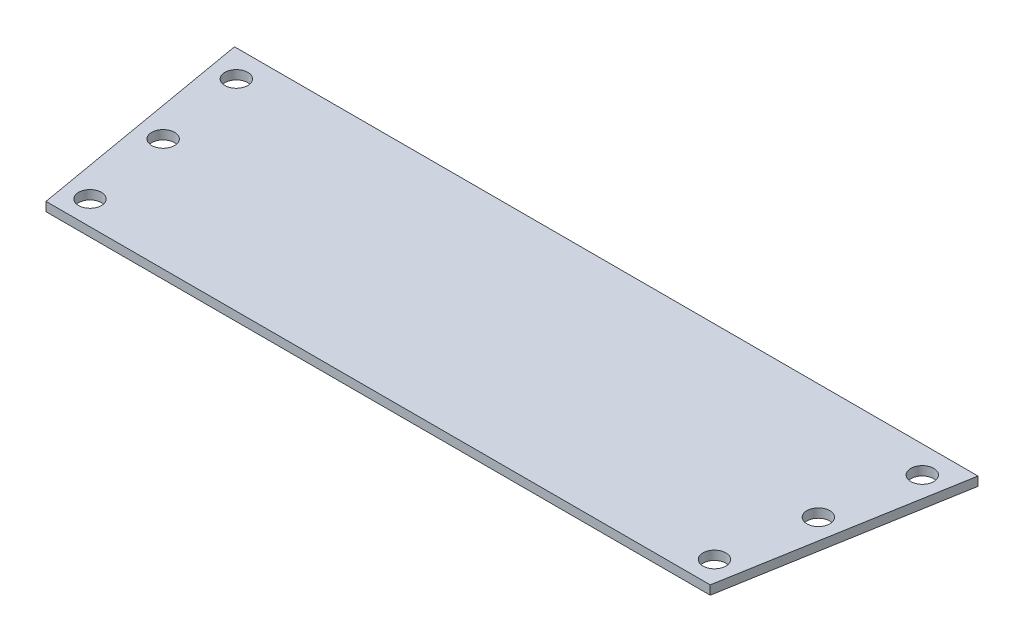
ISO-10303-21;
HEADER;
FILE_DESCRIPTION(('STEP AP214'),'2;1');
FILE_NAME('part.step','',(''),(''),'','','');
FILE_SCHEMA(('AUTOMOTIVE_DESIGN { 1 0 10303 214 1 1 1 1 }'));
ENDSEC;
DATA;
#1=APPLICATION_CONTEXT('core data for automotive mechanical design processes');
#2=APPLICATION_PROTOCOL_DEFINITION('international standard','automotive_design',2000,#1);
#3=PRODUCT_CONTEXT('',#1,'mechanical');
#4=PRODUCT('Part','Part','',(#3));
#5=PRODUCT_RELATED_PRODUCT_CATEGORY('part','',(#4));
#6=PRODUCT_DEFINITION_FORMATION('','',#4);
#7=PRODUCT_DEFINITION_CONTEXT('part definition',#1,'design');
#8=PRODUCT_DEFINITION('design','',#6,#7);
#9=PRODUCT_DEFINITION_SHAPE('','',#8);
#10=(LENGTH_UNIT() NAMED_UNIT(*) SI_UNIT(.MILLI.,.METRE.));
#11=(NAMED_UNIT(*) PLANE_ANGLE_UNIT() SI_UNIT($,.RADIAN.));
#12=(NAMED_UNIT(*) SI_UNIT($,.STERADIAN.) SOLID_ANGLE_UNIT());
#13=UNCERTAINTY_MEASURE_WITH_UNIT(LENGTH_MEASURE(1.E-05),#10,'distance_accuracy_value','');
#14=(GEOMETRIC_REPRESENTATION_CONTEXT(3) GLOBAL_UNCERTAINTY_ASSIGNED_CONTEXT((#13)) GLOBAL_UNIT_ASSIGNED_CONTEXT((#10,
#11,#12)) REPRESENTATION_CONTEXT('',''));
#15=CARTESIAN_POINT('',(0.,0.,0.));
#16=DIRECTION('',(0.,0.,1.));
#17=DIRECTION('',(1.,0.,0.));
#18=AXIS2_PLACEMENT_3D('',#15,#16,#17);
#19=CARTESIAN_POINT('',(0.,0.,0.));
#20=DIRECTION('',(0.,1.,0.));
#21=DIRECTION('',(0.,0.,1.));
#22=AXIS2_PLACEMENT_3D('',#19,#20,#21);
#23=PLANE('',#22);
#24=CARTESIAN_POINT('',(75.0785438249611,-7.7715611723761E-13,-4.29488451365112));
#25=DIRECTION('',(0.,0.999999999999995,0.));
#26=DIRECTION('',(0.,0.,0.999999999999931));
#27=AXIS2_PLACEMENT_3D('',#24,#25,#26);
#28=CIRCLE('',#27,2.54999999999999);
#29=CARTESIAN_POINT('',(75.0785438249611,-7.80066197354745E-13,-1.74488451365113));
#30=VERTEX_POINT('',#29);
#31=EDGE_CURVE('E320',#30,#30,#28,.T.);
#32=ORIENTED_EDGE('',*,*,#31,.T.);
#33=EDGE_LOOP('',(#32));
#34=FACE_BOUND('',#33,.T.);
#35=CARTESIAN_POINT('',(71.6567864300403,-9.57567358739198E-13,15.4102309726966));
#36=DIRECTION('',(0.,0.999999999999995,0.));
#37=DIRECTION('',(0.,0.,0.999999999999931));
#38=AXIS2_PLACEMENT_3D('',#35,#36,#37);
#39=CIRCLE('',#38,2.54999999999999);
#40=CARTESIAN_POINT('',(71.6567864300403,-9.60477438856333E-13,17.9602309726966));
#41=VERTEX_POINT('',#40);
#42=EDGE_CURVE('E309',#41,#41,#39,.T.);
#43=ORIENTED_EDGE('',*,*,#42,.T.);
#44=EDGE_LOOP('',(#43));
#45=FACE_BOUND('',#44,.T.);
#46=CARTESIAN_POINT('',(-74.1533728168104,-9.85322934354826E-13,-23.9999999999994));
#47=DIRECTION('',(0.,0.999999999999995,0.));
#48=DIRECTION('',(0.,0.,0.999999999999942));
#49=AXIS2_PLACEMENT_3D('',#46,#47,#48);
#50=CIRCLE('',#49,2.54999999999999);
#51=CARTESIAN_POINT('',(-74.1533728168104,-9.88233014471962E-13,-21.4499999999994));
#52=VERTEX_POINT('',#51);
#53=EDGE_CURVE('E290',#52,#52,#50,.T.);
#54=ORIENTED_EDGE('',*,*,#53,.T.);
#55=EDGE_LOOP('',(#54));
#56=FACE_BOUND('',#55,.T.);
#57=CARTESIAN_POINT('',(-70.7316154219015,-8.88178419700125E-13,-4.29488451365159));
#58=DIRECTION('',(0.,0.999999999999995,0.));
#59=DIRECTION('',(0.,0.,0.999999999999932));
#60=AXIS2_PLACEMENT_3D('',#57,#58,#59);
#61=CIRCLE('',#60,2.54999999999999);
#62=CARTESIAN_POINT('',(-70.7316154219015,-8.9108849981726E-13,-1.7448845136516));
#63=VERTEX_POINT('',#62);
#64=EDGE_CURVE('E296',#63,#63,#61,.T.);
#65=ORIENTED_EDGE('',*,*,#64,.T.);
#66=EDGE_LOOP('',(#65));
#67=FACE_BOUND('',#66,.T.);
#68=CARTESIAN_POINT('',(-67.3098580269691,-9.0205620750794E-13,15.4102309726962));
#69=DIRECTION('',(0.,0.999999999999995,0.));
#70=DIRECTION('',(0.,0.,0.999999999999931));
#71=AXIS2_PLACEMENT_3D('',#68,#69,#70);
#72=CIRCLE('',#71,2.54999999999999);
#73=CARTESIAN_POINT('',(-67.3098580269691,-9.04966287625075E-13,17.9602309726962));
#74=VERTEX_POINT('',#73);
#75=EDGE_CURVE('E297',#74,#74,#72,.T.);
#76=ORIENTED_EDGE('',*,*,#75,.T.);
#77=EDGE_LOOP('',(#76));
#78=FACE_BOUND('',#77,.T.);
#79=CARTESIAN_POINT('',(78.5003012198726,-4.9960036108132E-13,-23.9999999999989));
#80=DIRECTION('',(0.,0.999999999999995,0.));
#81=DIRECTION('',(0.,0.,0.999999999999931));
#82=AXIS2_PLACEMENT_3D('',#79,#80,#81);
#83=CIRCLE('',#82,2.54999999999999);
#84=CARTESIAN_POINT('',(78.5003012198726,-5.02510441198456E-13,-21.4499999999989));
#85=VERTEX_POINT('',#84);
#86=EDGE_CURVE('E308',#85,#85,#83,.T.);
#87=ORIENTED_EDGE('',*,*,#86,.T.);
#88=EDGE_LOOP('',(#87));
#89=FACE_BOUND('',#88,.T.);
#90=DIRECTION('',(-0.171087869746038,0.,0.985255774317392));
#91=VECTOR('',#90,1.);
#92=CARTESIAN_POINT('',(77.3579510360545,0.,13.4330672254587));
#93=LINE('',#92,#91);
#94=CARTESIAN_POINT('',(84.9000240102408,0.,-30.));
#95=VERTEX_POINT('',#94);
#96=CARTESIAN_POINT('',(76.0836749748174,0.,20.7713305942873));
#97=VERTEX_POINT('',#96);
#98=EDGE_CURVE('E269',#95,#97,#93,.T.);
#99=ORIENTED_EDGE('',*,*,#98,.T.);
#100=DIRECTION('',(1.,0.,0.));
#101=VECTOR('',#100,1.);
#102=CARTESIAN_POINT('',(0.,1.66533453693773E-13,20.771330594287));
#103=LINE('',#102,#101);
#104=CARTESIAN_POINT('',(-71.7367465717461,1.66533453693773E-13,20.7713305942868));
#105=VERTEX_POINT('',#104);
#106=EDGE_CURVE('E285',#105,#97,#103,.T.);
#107=ORIENTED_EDGE('',*,*,#106,.F.);
#108=DIRECTION('',(0.171087869746033,0.,0.985255774317392));
#109=VECTOR('',#108,1.);
#110=CARTESIAN_POINT('',(-73.1382618314956,0.,12.7003258847658));
#111=LINE('',#110,#109);
#112=CARTESIAN_POINT('',(-80.5530956071692,0.,-30.));
#113=VERTEX_POINT('',#112);
#114=EDGE_CURVE('E245',#113,#105,#111,.T.);
#115=ORIENTED_EDGE('',*,*,#114,.F.);
#116=DIRECTION('',(1.,0.,0.));
#117=VECTOR('',#116,1.);
#118=CARTESIAN_POINT('',(0.,0.,-30.));
#119=LINE('',#118,#117);
#120=EDGE_CURVE('E234',#113,#95,#119,.T.);
#121=ORIENTED_EDGE('',*,*,#120,.T.);
#122=EDGE_LOOP('',(#99,#107,#115,#121));
#123=FACE_BOUND('',#122,.T.);
#124=ADVANCED_FACE('F230',(#34,#45,#56,#67,#78,#89,#123),#23,.F.);
#125=CARTESIAN_POINT('',(0.,2.,-30.));
#126=DIRECTION('',(0.,0.,-1.));
#127=DIRECTION('',(-1.,0.,0.));
#128=AXIS2_PLACEMENT_3D('',#125,#126,#127);
#129=PLANE('',#128);
#130=DIRECTION('',(1.,0.,0.));
#131=VECTOR('',#130,1.);
#132=CARTESIAN_POINT('',(0.,2.,-30.));
#133=LINE('',#132,#131);
#134=CARTESIAN_POINT('',(-80.5530956071692,2.00000000000049,-30.));
#135=VERTEX_POINT('',#134);
#136=CARTESIAN_POINT('',(84.9000240102408,2.00000000000049,-30.));
#137=VERTEX_POINT('',#136);
#138=EDGE_CURVE('E12',#135,#137,#133,.T.);
#139=ORIENTED_EDGE('',*,*,#138,.T.);
#140=DIRECTION('',(0.,-1.,0.));
#141=VECTOR('',#140,1.);
#142=CARTESIAN_POINT('',(84.9000240102408,2.00000000000049,-30.));
#143=LINE('',#142,#141);
#144=EDGE_CURVE('E272',#137,#95,#143,.T.);
#145=ORIENTED_EDGE('',*,*,#144,.T.);
#146=ORIENTED_EDGE('',*,*,#120,.F.);
#147=DIRECTION('',(0.,-1.,0.));
#148=VECTOR('',#147,1.);
#149=CARTESIAN_POINT('',(-80.5530956071692,2.00000000000049,-30.));
#150=LINE('',#149,#148);
#151=EDGE_CURVE('E328',#135,#113,#150,.T.);
#152=ORIENTED_EDGE('',*,*,#151,.F.);
#153=EDGE_LOOP('',(#139,#145,#146,#152));
#154=FACE_BOUND('',#153,.T.);
#155=ADVANCED_FACE('F232',(#154),#129,.T.);
#156=CARTESIAN_POINT('',(0.,2.,0.));
#157=DIRECTION('',(0.,1.,0.));
#158=DIRECTION('',(0.,0.,1.));
#159=AXIS2_PLACEMENT_3D('',#156,#157,#158);
#160=PLANE('',#159);
#161=CARTESIAN_POINT('',(78.5003012198726,2.00000000000047,-23.9999999999989));
#162=DIRECTION('',(0.,0.999999999999995,0.));
#163=DIRECTION('',(0.,0.,0.999999999999931));
#164=AXIS2_PLACEMENT_3D('',#161,#162,#163);
#165=CIRCLE('',#164,2.54999999999999);
#166=CARTESIAN_POINT('',(78.5003012198726,2.00000000000047,-21.4499999999989));
#167=VERTEX_POINT('',#166);
#168=EDGE_CURVE('E305',#167,#167,#165,.T.);
#169=ORIENTED_EDGE('',*,*,#168,.F.);
#170=EDGE_LOOP('',(#169));
#171=FACE_BOUND('',#170,.T.);
#172=CARTESIAN_POINT('',(-67.3098580269691,2.00000000000007,15.4102309726962));
#173=DIRECTION('',(0.,0.999999999999995,0.));
#174=DIRECTION('',(0.,0.,0.999999999999931));
#175=AXIS2_PLACEMENT_3D('',#172,#173,#174);
#176=CIRCLE('',#175,2.54999999999999);
#177=CARTESIAN_POINT('',(-67.3098580269691,2.00000000000007,17.9602309726962));
#178=VERTEX_POINT('',#177);
#179=EDGE_CURVE('E312',#178,#178,#176,.T.);
#180=ORIENTED_EDGE('',*,*,#179,.F.);
#181=EDGE_LOOP('',(#180));
#182=FACE_BOUND('',#181,.T.);
#183=CARTESIAN_POINT('',(-70.7316154219015,2.00000000000009,-4.29488451365159));
#184=DIRECTION('',(0.,0.999999999999995,0.));
#185=DIRECTION('',(0.,0.,0.999999999999932));
#186=AXIS2_PLACEMENT_3D('',#183,#184,#185);
#187=CIRCLE('',#186,2.54999999999999);
#188=CARTESIAN_POINT('',(-70.7316154219015,2.00000000000008,-1.7448845136516));
#189=VERTEX_POINT('',#188);
#190=EDGE_CURVE('E293',#189,#189,#187,.T.);
#191=ORIENTED_EDGE('',*,*,#190,.F.);
#192=EDGE_LOOP('',(#191));
#193=FACE_BOUND('',#192,.T.);
#194=CARTESIAN_POINT('',(-74.1533728168104,1.99999999999999,-23.9999999999994));
#195=DIRECTION('',(0.,0.999999999999995,0.));
#196=DIRECTION('',(0.,0.,0.999999999999942));
#197=AXIS2_PLACEMENT_3D('',#194,#195,#196);
#198=CIRCLE('',#197,2.54999999999999);
#199=CARTESIAN_POINT('',(-74.1533728168104,1.99999999999999,-21.4499999999994));
#200=VERTEX_POINT('',#199);
#201=EDGE_CURVE('E300',#200,#200,#198,.T.);
#202=ORIENTED_EDGE('',*,*,#201,.F.);
#203=EDGE_LOOP('',(#202));
#204=FACE_BOUND('',#203,.T.);
#205=CARTESIAN_POINT('',(71.6567864300403,2.00000000000002,15.4102309726966));
#206=DIRECTION('',(0.,0.999999999999995,0.));
#207=DIRECTION('',(0.,0.,0.999999999999931));
#208=AXIS2_PLACEMENT_3D('',#205,#206,#207);
#209=CIRCLE('',#208,2.54999999999999);
#210=CARTESIAN_POINT('',(71.6567864300403,2.00000000000001,17.9602309726966));
#211=VERTEX_POINT('',#210);
#212=EDGE_CURVE('E323',#211,#211,#209,.T.);
#213=ORIENTED_EDGE('',*,*,#212,.F.);
#214=EDGE_LOOP('',(#213));
#215=FACE_BOUND('',#214,.T.);
#216=CARTESIAN_POINT('',(75.0785438249611,2.0000000000002,-4.29488451365112));
#217=DIRECTION('',(0.,0.999999999999995,0.));
#218=DIRECTION('',(0.,0.,0.999999999999931));
#219=AXIS2_PLACEMENT_3D('',#216,#217,#218);
#220=CIRCLE('',#219,2.54999999999999);
#221=CARTESIAN_POINT('',(75.0785438249611,2.00000000000019,-1.74488451365113));
#222=VERTEX_POINT('',#221);
#223=EDGE_CURVE('E317',#222,#222,#220,.T.);
#224=ORIENTED_EDGE('',*,*,#223,.F.);
#225=EDGE_LOOP('',(#224));
#226=FACE_BOUND('',#225,.T.);
#227=DIRECTION('',(1.,0.,0.));
#228=VECTOR('',#227,1.);
#229=CARTESIAN_POINT('',(0.,2.00000000000114,20.771330594287));
#230=LINE('',#229,#228);
#231=CARTESIAN_POINT('',(-71.7367465717461,2.00000000000049,20.7713305942868));
#232=VERTEX_POINT('',#231);
#233=CARTESIAN_POINT('',(76.0836749748174,2.00000000000114,20.7713305942873));
#234=VERTEX_POINT('',#233);
#235=EDGE_CURVE('E286',#232,#234,#230,.T.);
#236=ORIENTED_EDGE('',*,*,#235,.T.);
#237=DIRECTION('',(-0.171087869746038,0.,0.985255774317392));
#238=VECTOR('',#237,1.);
#239=CARTESIAN_POINT('',(77.3579510360545,2.00000000000049,13.4330672254587));
#240=LINE('',#239,#238);
#241=EDGE_CURVE('E253',#137,#234,#240,.T.);
#242=ORIENTED_EDGE('',*,*,#241,.F.);
#243=ORIENTED_EDGE('',*,*,#138,.F.);
#244=DIRECTION('',(0.171087869746033,0.,0.985255774317392));
#245=VECTOR('',#244,1.);
#246=CARTESIAN_POINT('',(-73.1382618314956,2.00000000000049,12.7003258847658));
#247=LINE('',#246,#245);
#248=EDGE_CURVE('E330',#135,#232,#247,.T.);
#249=ORIENTED_EDGE('',*,*,#248,.T.);
#250=EDGE_LOOP('',(#236,#242,#243,#249));
#251=FACE_BOUND('',#250,.T.);
#252=ADVANCED_FACE('F338',(#171,#182,#193,#204,#215,#226,#251),#160,.T.);
#253=CARTESIAN_POINT('',(0.,1.66533453693773E-13,20.771330594287));
#254=DIRECTION('',(0.,0.,1.));
#255=DIRECTION('',(1.,0.,0.));
#256=AXIS2_PLACEMENT_3D('',#253,#254,#255);
#257=PLANE('',#256);
#258=ORIENTED_EDGE('',*,*,#106,.T.);
#259=DIRECTION('',(0.,-1.,0.));
#260=VECTOR('',#259,1.);
#261=CARTESIAN_POINT('',(76.0836749748174,2.00000000000049,20.7713305942873));
#262=LINE('',#261,#260);
#263=EDGE_CURVE('E273',#234,#97,#262,.T.);
#264=ORIENTED_EDGE('',*,*,#263,.F.);
#265=ORIENTED_EDGE('',*,*,#235,.F.);
#266=DIRECTION('',(0.,-1.,0.));
#267=VECTOR('',#266,1.);
#268=CARTESIAN_POINT('',(-71.7367465717461,2.00000000000049,20.7713305942868));
#269=LINE('',#268,#267);
#270=EDGE_CURVE('E278',#232,#105,#269,.T.);
#271=ORIENTED_EDGE('',*,*,#270,.T.);
#272=EDGE_LOOP('',(#258,#264,#265,#271));
#273=FACE_BOUND('',#272,.T.);
#274=ADVANCED_FACE('F339',(#273),#257,.T.);
#275=CARTESIAN_POINT('',(75.0785438249611,-7.7715611723761E-13,-4.29488451365112));
#276=DIRECTION('',(0.,1.,0.));
#277=DIRECTION('',(0.,0.,1.));
#278=AXIS2_PLACEMENT_3D('',#275,#276,#277);
#279=CYLINDRICAL_SURFACE('',#278,2.54999999999999);
#280=CARTESIAN_POINT('',(75.0785438249611,-7.80066197354745E-13,-1.74488451365113));
#281=CARTESIAN_POINT('',(75.0785438249611,0.0208333333325634,-1.74488451365113));
#282=CARTESIAN_POINT('',(75.0785438249611,0.0416666666659069,-1.74488451365113));
#283=CARTESIAN_POINT('',(75.0785438249611,0.0833333333325939,-1.74488451365113));
#284=CARTESIAN_POINT('',(75.0785438249611,0.104166666665937,-1.74488451365113));
#285=CARTESIAN_POINT('',(75.0785438249611,0.145833333332624,-1.74488451365113));
#286=CARTESIAN_POINT('',(75.0785438249611,0.166666666665968,-1.74488451365113));
#287=CARTESIAN_POINT('',(75.0785438249611,0.208333333332655,-1.74488451365113));
#288=CARTESIAN_POINT('',(75.0785438249611,0.229166666665998,-1.74488451365113));
#289=CARTESIAN_POINT('',(75.0785438249611,0.270833333332685,-1.74488451365113));
#290=CARTESIAN_POINT('',(75.0785438249611,0.291666666666029,-1.74488451365113));
#291=CARTESIAN_POINT('',(75.0785438249611,0.333333333332716,-1.74488451365113));
#292=CARTESIAN_POINT('',(75.0785438249611,0.354166666666059,-1.74488451365113));
#293=CARTESIAN_POINT('',(75.0785438249611,0.395833333332746,-1.74488451365113));
#294=CARTESIAN_POINT('',(75.0785438249611,0.416666666666089,-1.74488451365113));
#295=CARTESIAN_POINT('',(75.0785438249611,0.458333333332776,-1.74488451365113));
#296=CARTESIAN_POINT('',(75.0785438249611,0.47916666666612,-1.74488451365113));
#297=CARTESIAN_POINT('',(75.0785438249611,0.520833333332807,-1.74488451365113));
#298=CARTESIAN_POINT('',(75.0785438249611,0.54166666666615,-1.74488451365113));
#299=CARTESIAN_POINT('',(75.0785438249611,0.583333333332837,-1.74488451365113));
#300=CARTESIAN_POINT('',(75.0785438249611,0.604166666666181,-1.74488451365113));
#301=CARTESIAN_POINT('',(75.0785438249611,0.645833333332868,-1.74488451365113));
#302=CARTESIAN_POINT('',(75.0785438249611,0.666666666666211,-1.74488451365113));
#303=CARTESIAN_POINT('',(75.0785438249611,0.708333333332898,-1.74488451365113));
#304=CARTESIAN_POINT('',(75.0785438249611,0.729166666666242,-1.74488451365113));
#305=CARTESIAN_POINT('',(75.0785438249611,0.770833333332929,-1.74488451365113));
#306=CARTESIAN_POINT('',(75.0785438249611,0.791666666666272,-1.74488451365113));
#307=CARTESIAN_POINT('',(75.0785438249611,0.833333333332959,-1.74488451365113));
#308=CARTESIAN_POINT('',(75.0785438249611,0.854166666666302,-1.74488451365113));
#309=CARTESIAN_POINT('',(75.0785438249611,0.895833333332989,-1.74488451365113));
#310=CARTESIAN_POINT('',(75.0785438249611,0.916666666666333,-1.74488451365113));
#311=CARTESIAN_POINT('',(75.0785438249611,0.95833333333302,-1.74488451365113));
#312=CARTESIAN_POINT('',(75.0785438249611,0.979166666666363,-1.74488451365113));
#313=CARTESIAN_POINT('',(75.0785438249611,1.02083333333305,-1.74488451365113));
#314=CARTESIAN_POINT('',(75.0785438249611,1.04166666666639,-1.74488451365113));
#315=CARTESIAN_POINT('',(75.0785438249611,1.08333333333308,-1.74488451365113));
#316=CARTESIAN_POINT('',(75.0785438249611,1.10416666666642,-1.74488451365113));
#317=CARTESIAN_POINT('',(75.0785438249611,1.14583333333311,-1.74488451365113));
#318=CARTESIAN_POINT('',(75.0785438249611,1.16666666666645,-1.74488451365113));
#319=CARTESIAN_POINT('',(75.0785438249611,1.20833333333314,-1.74488451365113));
#320=CARTESIAN_POINT('',(75.0785438249611,1.22916666666649,-1.74488451365113));
#321=CARTESIAN_POINT('',(75.0785438249611,1.27083333333317,-1.74488451365113));
#322=CARTESIAN_POINT('',(75.0785438249611,1.29166666666652,-1.74488451365113));
#323=CARTESIAN_POINT('',(75.0785438249611,1.3333333333332,-1.74488451365113));
#324=CARTESIAN_POINT('',(75.0785438249611,1.35416666666655,-1.74488451365113));
#325=CARTESIAN_POINT('',(75.0785438249611,1.39583333333323,-1.74488451365113));
#326=CARTESIAN_POINT('',(75.0785438249611,1.41666666666658,-1.74488451365113));
#327=CARTESIAN_POINT('',(75.0785438249611,1.45833333333326,-1.74488451365113));
#328=CARTESIAN_POINT('',(75.0785438249611,1.47916666666661,-1.74488451365113));
#329=CARTESIAN_POINT('',(75.0785438249611,1.52083333333329,-1.74488451365113));
#330=CARTESIAN_POINT('',(75.0785438249611,1.54166666666664,-1.74488451365113));
#331=CARTESIAN_POINT('',(75.0785438249611,1.58333333333332,-1.74488451365113));
#332=CARTESIAN_POINT('',(75.0785438249611,1.60416666666667,-1.74488451365113));
#333=CARTESIAN_POINT('',(75.0785438249611,1.64583333333335,-1.74488451365113));
#334=CARTESIAN_POINT('',(75.0785438249611,1.6666666666667,-1.74488451365113));
#335=CARTESIAN_POINT('',(75.0785438249611,1.70833333333338,-1.74488451365113));
#336=CARTESIAN_POINT('',(75.0785438249611,1.72916666666673,-1.74488451365113));
#337=CARTESIAN_POINT('',(75.0785438249611,1.77083333333342,-1.74488451365113));
#338=CARTESIAN_POINT('',(75.0785438249611,1.79166666666676,-1.74488451365113));
#339=CARTESIAN_POINT('',(75.0785438249611,1.83333333333345,-1.74488451365113));
#340=CARTESIAN_POINT('',(75.0785438249611,1.85416666666679,-1.74488451365113));
#341=CARTESIAN_POINT('',(75.0785438249611,1.89583333333348,-1.74488451365113));
#342=CARTESIAN_POINT('',(75.0785438249611,1.91666666666682,-1.74488451365113));
#343=CARTESIAN_POINT('',(75.0785438249611,1.95833333333351,-1.74488451365113));
#344=CARTESIAN_POINT('',(75.0785438249611,1.97916666666685,-1.74488451365113));
#345=CARTESIAN_POINT('',(75.0785438249611,2.00000000000019,-1.74488451365113));
#346=B_SPLINE_CURVE_WITH_KNOTS('',3,(#280,#281,#282,#283,#284,#285,#286,#287,#288,#289,#290,
#291,#292,#293,#294,#295,#296,#297,#298,#299,#300,#301,#302,#303,#304,#305,#306,#307,#308,#309,
#310,#311,#312,#313,#314,#315,#316,#317,#318,#319,#320,#321,#322,#323,#324,#325,#326,#327,#328,
#329,#330,#331,#332,#333,#334,#335,#336,#337,#338,#339,#340,#341,#342,#343,#344,#345),
.UNSPECIFIED.,.F.,.F.,(4,2,2,2,2,2,2,2,2,2,2,2,2,2,2,2,2,2,2,2,2,2,2,2,2,2,2,2,2,2,2,2,4),(0.,
0.0625000000000304,0.125000000000061,0.187500000000091,0.250000000000122,0.312500000000152,
0.375000000000183,0.437500000000213,0.500000000000243,0.562500000000274,0.625000000000304,
0.687500000000335,0.750000000000365,0.812500000000396,0.875000000000426,0.937500000000456,
1.00000000000049,1.06250000000052,1.12500000000055,1.18750000000058,1.25000000000061,
1.31250000000064,1.37500000000067,1.4375000000007,1.50000000000073,1.56250000000076,
1.62500000000079,1.68750000000082,1.75000000000085,1.81250000000088,1.87500000000091,
1.93750000000094,2.00000000000097),.UNSPECIFIED.);
#347=EDGE_CURVE('BSEAM366',#30,#222,#346,.T.);
#348=ORIENTED_EDGE('',*,*,#31,.F.);
#349=ORIENTED_EDGE('',*,*,#223,.T.);
#350=ORIENTED_EDGE('',*,*,#347,.T.);
#351=ORIENTED_EDGE('',*,*,#347,.F.);
#352=EDGE_LOOP('',(#348,#350,#349,#351));
#353=FACE_BOUND('',#352,.T.);
#354=ADVANCED_FACE('F366',(#353),#279,.F.);
#355=CARTESIAN_POINT('',(71.6567864300403,-9.57567358739198E-13,15.4102309726966));
#356=DIRECTION('',(0.,1.,0.));
#357=DIRECTION('',(0.,0.,1.));
#358=AXIS2_PLACEMENT_3D('',#355,#356,#357);
#359=CYLINDRICAL_SURFACE('',#358,2.54999999999999);
#360=CARTESIAN_POINT('',(71.6567864300403,-9.60477438856333E-13,17.9602309726966));
#361=CARTESIAN_POINT('',(71.6567864300403,0.020833333332383,17.9602309726966));
#362=CARTESIAN_POINT('',(71.6567864300403,0.0416666666657265,17.9602309726966));
#363=CARTESIAN_POINT('',(71.6567864300403,0.0833333333324134,17.9602309726966));
#364=CARTESIAN_POINT('',(71.6567864300403,0.104166666665757,17.9602309726966));
#365=CARTESIAN_POINT('',(71.6567864300403,0.145833333332444,17.9602309726966));
#366=CARTESIAN_POINT('',(71.6567864300403,0.166666666665787,17.9602309726966));
#367=CARTESIAN_POINT('',(71.6567864300403,0.208333333332474,17.9602309726966));
#368=CARTESIAN_POINT('',(71.6567864300403,0.229166666665818,17.9602309726966));
#369=CARTESIAN_POINT('',(71.6567864300403,0.270833333332505,17.9602309726966));
#370=CARTESIAN_POINT('',(71.6567864300403,0.291666666665848,17.9602309726966));
#371=CARTESIAN_POINT('',(71.6567864300403,0.333333333332535,17.9602309726966));
#372=CARTESIAN_POINT('',(71.6567864300403,0.354166666665879,17.9602309726966));
#373=CARTESIAN_POINT('',(71.6567864300403,0.395833333332566,17.9602309726966));
#374=CARTESIAN_POINT('',(71.6567864300403,0.416666666665909,17.9602309726966));
#375=CARTESIAN_POINT('',(71.6567864300403,0.458333333332596,17.9602309726966));
#376=CARTESIAN_POINT('',(71.6567864300403,0.479166666665939,17.9602309726966));
#377=CARTESIAN_POINT('',(71.6567864300403,0.520833333332626,17.9602309726966));
#378=CARTESIAN_POINT('',(71.6567864300403,0.54166666666597,17.9602309726966));
#379=CARTESIAN_POINT('',(71.6567864300403,0.583333333332657,17.9602309726966));
#380=CARTESIAN_POINT('',(71.6567864300403,0.604166666666,17.9602309726966));
#381=CARTESIAN_POINT('',(71.6567864300403,0.645833333332687,17.9602309726966));
#382=CARTESIAN_POINT('',(71.6567864300403,0.666666666666031,17.9602309726966));
#383=CARTESIAN_POINT('',(71.6567864300403,0.708333333332718,17.9602309726966));
#384=CARTESIAN_POINT('',(71.6567864300403,0.729166666666061,17.9602309726966));
#385=CARTESIAN_POINT('',(71.6567864300403,0.770833333332748,17.9602309726966));
#386=CARTESIAN_POINT('',(71.6567864300403,0.791666666666092,17.9602309726966));
#387=CARTESIAN_POINT('',(71.6567864300403,0.833333333332779,17.9602309726966));
#388=CARTESIAN_POINT('',(71.6567864300403,0.854166666666122,17.9602309726966));
#389=CARTESIAN_POINT('',(71.6567864300403,0.895833333332809,17.9602309726966));
#390=CARTESIAN_POINT('',(71.6567864300403,0.916666666666152,17.9602309726966));
#391=CARTESIAN_POINT('',(71.6567864300403,0.958333333332839,17.9602309726966));
#392=CARTESIAN_POINT('',(71.6567864300403,0.979166666666183,17.9602309726966));
#393=CARTESIAN_POINT('',(71.6567864300403,1.02083333333287,17.9602309726966));
#394=CARTESIAN_POINT('',(71.6567864300403,1.04166666666621,17.9602309726966));
#395=CARTESIAN_POINT('',(71.6567864300403,1.0833333333329,17.9602309726966));
#396=CARTESIAN_POINT('',(71.6567864300403,1.10416666666624,17.9602309726966));
#397=CARTESIAN_POINT('',(71.6567864300403,1.14583333333293,17.9602309726966));
#398=CARTESIAN_POINT('',(71.6567864300403,1.16666666666627,17.9602309726966));
#399=CARTESIAN_POINT('',(71.6567864300403,1.20833333333296,17.9602309726966));
#400=CARTESIAN_POINT('',(71.6567864300403,1.2291666666663,17.9602309726966));
#401=CARTESIAN_POINT('',(71.6567864300403,1.27083333333299,17.9602309726966));
#402=CARTESIAN_POINT('',(71.6567864300403,1.29166666666634,17.9602309726966));
#403=CARTESIAN_POINT('',(71.6567864300403,1.33333333333302,17.9602309726966));
#404=CARTESIAN_POINT('',(71.6567864300403,1.35416666666637,17.9602309726966));
#405=CARTESIAN_POINT('',(71.6567864300403,1.39583333333305,17.9602309726966));
#406=CARTESIAN_POINT('',(71.6567864300403,1.4166666666664,17.9602309726966));
#407=CARTESIAN_POINT('',(71.6567864300403,1.45833333333308,17.9602309726966));
#408=CARTESIAN_POINT('',(71.6567864300403,1.47916666666643,17.9602309726966));
#409=CARTESIAN_POINT('',(71.6567864300403,1.52083333333311,17.9602309726966));
#410=CARTESIAN_POINT('',(71.6567864300403,1.54166666666646,17.9602309726966));
#411=CARTESIAN_POINT('',(71.6567864300403,1.58333333333314,17.9602309726966));
#412=CARTESIAN_POINT('',(71.6567864300403,1.60416666666649,17.9602309726966));
#413=CARTESIAN_POINT('',(71.6567864300403,1.64583333333317,17.9602309726966));
#414=CARTESIAN_POINT('',(71.6567864300403,1.66666666666652,17.9602309726966));
#415=CARTESIAN_POINT('',(71.6567864300403,1.7083333333332,17.9602309726966));
#416=CARTESIAN_POINT('',(71.6567864300403,1.72916666666655,17.9602309726966));
#417=CARTESIAN_POINT('',(71.6567864300403,1.77083333333324,17.9602309726966));
#418=CARTESIAN_POINT('',(71.6567864300403,1.79166666666658,17.9602309726966));
#419=CARTESIAN_POINT('',(71.6567864300403,1.83333333333327,17.9602309726966));
#420=CARTESIAN_POINT('',(71.6567864300403,1.85416666666661,17.9602309726966));
#421=CARTESIAN_POINT('',(71.6567864300403,1.8958333333333,17.9602309726966));
#422=CARTESIAN_POINT('',(71.6567864300403,1.91666666666664,17.9602309726966));
#423=CARTESIAN_POINT('',(71.6567864300403,1.95833333333333,17.9602309726966));
#424=CARTESIAN_POINT('',(71.6567864300403,1.97916666666667,17.9602309726966));
#425=CARTESIAN_POINT('',(71.6567864300403,2.00000000000001,17.9602309726966));
#426=B_SPLINE_CURVE_WITH_KNOTS('',3,(#360,#361,#362,#363,#364,#365,#366,#367,#368,#369,#370,
#371,#372,#373,#374,#375,#376,#377,#378,#379,#380,#381,#382,#383,#384,#385,#386,#387,#388,#389,
#390,#391,#392,#393,#394,#395,#396,#397,#398,#399,#400,#401,#402,#403,#404,#405,#406,#407,#408,
#409,#410,#411,#412,#413,#414,#415,#416,#417,#418,#419,#420,#421,#422,#423,#424,#425),
.UNSPECIFIED.,.F.,.F.,(4,2,2,2,2,2,2,2,2,2,2,2,2,2,2,2,2,2,2,2,2,2,2,2,2,2,2,2,2,2,2,2,4),(0.,
0.0625000000000304,0.125000000000061,0.187500000000091,0.250000000000122,0.312500000000152,
0.375000000000183,0.437500000000213,0.500000000000243,0.562500000000274,0.625000000000304,
0.687500000000335,0.750000000000365,0.812500000000396,0.875000000000426,0.937500000000456,
1.00000000000049,1.06250000000052,1.12500000000055,1.18750000000058,1.25000000000061,
1.31250000000064,1.37500000000067,1.4375000000007,1.50000000000073,1.56250000000076,
1.62500000000079,1.68750000000082,1.75000000000085,1.81250000000088,1.87500000000091,
1.93750000000094,2.00000000000097),.UNSPECIFIED.);
#427=EDGE_CURVE('BSEAM373',#41,#211,#426,.T.);
#428=ORIENTED_EDGE('',*,*,#42,.F.);
#429=ORIENTED_EDGE('',*,*,#212,.T.);
#430=ORIENTED_EDGE('',*,*,#427,.T.);
#431=ORIENTED_EDGE('',*,*,#427,.F.);
#432=EDGE_LOOP('',(#428,#430,#429,#431));
#433=FACE_BOUND('',#432,.T.);
#434=ADVANCED_FACE('F373',(#433),#359,.F.);
#435=CARTESIAN_POINT('',(-74.1533728168104,-9.85322934354826E-13,-23.9999999999994));
#436=DIRECTION('',(0.,1.,0.));
#437=DIRECTION('',(0.,0.,1.));
#438=AXIS2_PLACEMENT_3D('',#435,#436,#437);
#439=CYLINDRICAL_SURFACE('',#438,2.54999999999999);
#440=CARTESIAN_POINT('',(-74.1533728168104,-9.88233014471962E-13,-21.4499999999994));
#441=CARTESIAN_POINT('',(-74.1533728168104,0.0208333333323552,-21.4499999999994));
#442=CARTESIAN_POINT('',(-74.1533728168104,0.0416666666656987,-21.4499999999994));
#443=CARTESIAN_POINT('',(-74.1533728168104,0.0833333333323857,-21.4499999999994));
#444=CARTESIAN_POINT('',(-74.1533728168104,0.104166666665729,-21.4499999999994));
#445=CARTESIAN_POINT('',(-74.1533728168104,0.145833333332416,-21.4499999999994));
#446=CARTESIAN_POINT('',(-74.1533728168104,0.16666666666576,-21.4499999999994));
#447=CARTESIAN_POINT('',(-74.1533728168104,0.208333333332447,-21.4499999999994));
#448=CARTESIAN_POINT('',(-74.1533728168104,0.22916666666579,-21.4499999999994));
#449=CARTESIAN_POINT('',(-74.1533728168104,0.270833333332477,-21.4499999999994));
#450=CARTESIAN_POINT('',(-74.1533728168104,0.29166666666582,-21.4499999999994));
#451=CARTESIAN_POINT('',(-74.1533728168104,0.333333333332507,-21.4499999999994));
#452=CARTESIAN_POINT('',(-74.1533728168104,0.354166666665851,-21.4499999999994));
#453=CARTESIAN_POINT('',(-74.1533728168104,0.395833333332538,-21.4499999999994));
#454=CARTESIAN_POINT('',(-74.1533728168104,0.416666666665881,-21.4499999999994));
#455=CARTESIAN_POINT('',(-74.1533728168104,0.458333333332568,-21.4499999999994));
#456=CARTESIAN_POINT('',(-74.1533728168104,0.479166666665912,-21.4499999999994));
#457=CARTESIAN_POINT('',(-74.1533728168104,0.520833333332599,-21.4499999999994));
#458=CARTESIAN_POINT('',(-74.1533728168104,0.541666666665942,-21.4499999999994));
#459=CARTESIAN_POINT('',(-74.1533728168104,0.583333333332629,-21.4499999999994));
#460=CARTESIAN_POINT('',(-74.1533728168104,0.604166666665973,-21.4499999999994));
#461=CARTESIAN_POINT('',(-74.1533728168104,0.645833333332659,-21.4499999999994));
#462=CARTESIAN_POINT('',(-74.1533728168104,0.666666666666003,-21.4499999999994));
#463=CARTESIAN_POINT('',(-74.1533728168104,0.70833333333269,-21.4499999999994));
#464=CARTESIAN_POINT('',(-74.1533728168104,0.729166666666033,-21.4499999999994));
#465=CARTESIAN_POINT('',(-74.1533728168104,0.77083333333272,-21.4499999999994));
#466=CARTESIAN_POINT('',(-74.1533728168104,0.791666666666064,-21.4499999999994));
#467=CARTESIAN_POINT('',(-74.1533728168104,0.833333333332751,-21.4499999999994));
#468=CARTESIAN_POINT('',(-74.1533728168104,0.854166666666094,-21.4499999999994));
#469=CARTESIAN_POINT('',(-74.1533728168104,0.895833333332781,-21.4499999999994));
#470=CARTESIAN_POINT('',(-74.1533728168104,0.916666666666125,-21.4499999999994));
#471=CARTESIAN_POINT('',(-74.1533728168104,0.958333333332812,-21.4499999999994));
#472=CARTESIAN_POINT('',(-74.1533728168104,0.979166666666155,-21.4499999999994));
#473=CARTESIAN_POINT('',(-74.1533728168104,1.02083333333284,-21.4499999999994));
#474=CARTESIAN_POINT('',(-74.1533728168104,1.04166666666619,-21.4499999999994));
#475=CARTESIAN_POINT('',(-74.1533728168104,1.08333333333287,-21.4499999999994));
#476=CARTESIAN_POINT('',(-74.1533728168104,1.10416666666622,-21.4499999999994));
#477=CARTESIAN_POINT('',(-74.1533728168104,1.1458333333329,-21.4499999999994));
#478=CARTESIAN_POINT('',(-74.1533728168104,1.16666666666625,-21.4499999999994));
#479=CARTESIAN_POINT('',(-74.1533728168104,1.20833333333293,-21.4499999999994));
#480=CARTESIAN_POINT('',(-74.1533728168104,1.22916666666628,-21.4499999999994));
#481=CARTESIAN_POINT('',(-74.1533728168104,1.27083333333296,-21.4499999999994));
#482=CARTESIAN_POINT('',(-74.1533728168104,1.29166666666631,-21.4499999999994));
#483=CARTESIAN_POINT('',(-74.1533728168104,1.33333333333299,-21.4499999999994));
#484=CARTESIAN_POINT('',(-74.1533728168104,1.35416666666634,-21.4499999999994));
#485=CARTESIAN_POINT('',(-74.1533728168104,1.39583333333302,-21.4499999999994));
#486=CARTESIAN_POINT('',(-74.1533728168104,1.41666666666637,-21.4499999999994));
#487=CARTESIAN_POINT('',(-74.1533728168104,1.45833333333306,-21.4499999999994));
#488=CARTESIAN_POINT('',(-74.1533728168104,1.4791666666664,-21.4499999999994));
#489=CARTESIAN_POINT('',(-74.1533728168104,1.52083333333309,-21.4499999999994));
#490=CARTESIAN_POINT('',(-74.1533728168104,1.54166666666643,-21.4499999999994));
#491=CARTESIAN_POINT('',(-74.1533728168104,1.58333333333312,-21.4499999999994));
#492=CARTESIAN_POINT('',(-74.1533728168104,1.60416666666646,-21.4499999999994));
#493=CARTESIAN_POINT('',(-74.1533728168104,1.64583333333315,-21.4499999999994));
#494=CARTESIAN_POINT('',(-74.1533728168104,1.66666666666649,-21.4499999999994));
#495=CARTESIAN_POINT('',(-74.1533728168104,1.70833333333318,-21.4499999999994));
#496=CARTESIAN_POINT('',(-74.1533728168104,1.72916666666652,-21.4499999999994));
#497=CARTESIAN_POINT('',(-74.1533728168104,1.77083333333321,-21.4499999999994));
#498=CARTESIAN_POINT('',(-74.1533728168104,1.79166666666655,-21.4499999999994));
#499=CARTESIAN_POINT('',(-74.1533728168104,1.83333333333324,-21.4499999999994));
#500=CARTESIAN_POINT('',(-74.1533728168104,1.85416666666658,-21.4499999999994));
#501=CARTESIAN_POINT('',(-74.1533728168104,1.89583333333327,-21.4499999999994));
#502=CARTESIAN_POINT('',(-74.1533728168104,1.91666666666661,-21.4499999999994));
#503=CARTESIAN_POINT('',(-74.1533728168104,1.9583333333333,-21.4499999999994));
#504=CARTESIAN_POINT('',(-74.1533728168104,1.97916666666664,-21.4499999999994));
#505=CARTESIAN_POINT('',(-74.1533728168104,1.99999999999999,-21.4499999999994));
#506=B_SPLINE_CURVE_WITH_KNOTS('',3,(#440,#441,#442,#443,#444,#445,#446,#447,#448,#449,#450,
#451,#452,#453,#454,#455,#456,#457,#458,#459,#460,#461,#462,#463,#464,#465,#466,#467,#468,#469,
#470,#471,#472,#473,#474,#475,#476,#477,#478,#479,#480,#481,#482,#483,#484,#485,#486,#487,#488,
#489,#490,#491,#492,#493,#494,#495,#496,#497,#498,#499,#500,#501,#502,#503,#504,#505),
.UNSPECIFIED.,.F.,.F.,(4,2,2,2,2,2,2,2,2,2,2,2,2,2,2,2,2,2,2,2,2,2,2,2,2,2,2,2,2,2,2,2,4),(0.,
0.0625000000000304,0.125000000000061,0.187500000000091,0.250000000000122,0.312500000000152,
0.375000000000183,0.437500000000213,0.500000000000243,0.562500000000274,0.625000000000304,
0.687500000000335,0.750000000000365,0.812500000000396,0.875000000000426,0.937500000000456,
1.00000000000049,1.06250000000052,1.12500000000055,1.18750000000058,1.25000000000061,
1.31250000000064,1.37500000000067,1.4375000000007,1.50000000000073,1.56250000000076,
1.62500000000079,1.68750000000082,1.75000000000085,1.81250000000088,1.87500000000091,
1.93750000000094,2.00000000000097),.UNSPECIFIED.);
#507=EDGE_CURVE('BSEAM370',#52,#200,#506,.T.);
#508=ORIENTED_EDGE('',*,*,#53,.F.);
#509=ORIENTED_EDGE('',*,*,#201,.T.);
#510=ORIENTED_EDGE('',*,*,#507,.T.);
#511=ORIENTED_EDGE('',*,*,#507,.F.);
#512=EDGE_LOOP('',(#508,#510,#509,#511));
#513=FACE_BOUND('',#512,.T.);
#514=ADVANCED_FACE('F370',(#513),#439,.F.);
#515=CARTESIAN_POINT('',(-70.7316154219015,-8.88178419700125E-13,-4.29488451365159));
#516=DIRECTION('',(0.,1.,0.));
#517=DIRECTION('',(0.,0.,1.));
#518=AXIS2_PLACEMENT_3D('',#515,#516,#517);
#519=CYLINDRICAL_SURFACE('',#518,2.54999999999999);
#520=CARTESIAN_POINT('',(-70.7316154219015,-8.9108849981726E-13,-1.7448845136516));
#521=CARTESIAN_POINT('',(-70.7316154219015,0.0208333333324524,-1.7448845136516));
#522=CARTESIAN_POINT('',(-70.7316154219015,0.0416666666657958,-1.7448845136516));
#523=CARTESIAN_POINT('',(-70.7316154219015,0.0833333333324828,-1.7448845136516));
#524=CARTESIAN_POINT('',(-70.7316154219015,0.104166666665826,-1.7448845136516));
#525=CARTESIAN_POINT('',(-70.7316154219015,0.145833333332513,-1.7448845136516));
#526=CARTESIAN_POINT('',(-70.7316154219015,0.166666666665857,-1.7448845136516));
#527=CARTESIAN_POINT('',(-70.7316154219015,0.208333333332544,-1.7448845136516));
#528=CARTESIAN_POINT('',(-70.7316154219015,0.229166666665887,-1.7448845136516));
#529=CARTESIAN_POINT('',(-70.7316154219015,0.270833333332574,-1.7448845136516));
#530=CARTESIAN_POINT('',(-70.7316154219015,0.291666666665918,-1.7448845136516));
#531=CARTESIAN_POINT('',(-70.7316154219015,0.333333333332605,-1.7448845136516));
#532=CARTESIAN_POINT('',(-70.7316154219015,0.354166666665948,-1.7448845136516));
#533=CARTESIAN_POINT('',(-70.7316154219015,0.395833333332635,-1.7448845136516));
#534=CARTESIAN_POINT('',(-70.7316154219015,0.416666666665978,-1.7448845136516));
#535=CARTESIAN_POINT('',(-70.7316154219015,0.458333333332665,-1.7448845136516));
#536=CARTESIAN_POINT('',(-70.7316154219015,0.479166666666009,-1.7448845136516));
#537=CARTESIAN_POINT('',(-70.7316154219015,0.520833333332696,-1.7448845136516));
#538=CARTESIAN_POINT('',(-70.7316154219015,0.541666666666039,-1.7448845136516));
#539=CARTESIAN_POINT('',(-70.7316154219015,0.583333333332726,-1.7448845136516));
#540=CARTESIAN_POINT('',(-70.7316154219015,0.60416666666607,-1.7448845136516));
#541=CARTESIAN_POINT('',(-70.7316154219015,0.645833333332757,-1.7448845136516));
#542=CARTESIAN_POINT('',(-70.7316154219015,0.6666666666661,-1.7448845136516));
#543=CARTESIAN_POINT('',(-70.7316154219015,0.708333333332787,-1.7448845136516));
#544=CARTESIAN_POINT('',(-70.7316154219015,0.729166666666131,-1.7448845136516));
#545=CARTESIAN_POINT('',(-70.7316154219015,0.770833333332818,-1.7448845136516));
#546=CARTESIAN_POINT('',(-70.7316154219015,0.791666666666161,-1.7448845136516));
#547=CARTESIAN_POINT('',(-70.7316154219015,0.833333333332848,-1.7448845136516));
#548=CARTESIAN_POINT('',(-70.7316154219015,0.854166666666191,-1.7448845136516));
#549=CARTESIAN_POINT('',(-70.7316154219015,0.895833333332878,-1.7448845136516));
#550=CARTESIAN_POINT('',(-70.7316154219015,0.916666666666222,-1.7448845136516));
#551=CARTESIAN_POINT('',(-70.7316154219015,0.958333333332909,-1.7448845136516));
#552=CARTESIAN_POINT('',(-70.7316154219015,0.979166666666252,-1.7448845136516));
#553=CARTESIAN_POINT('',(-70.7316154219015,1.02083333333294,-1.7448845136516));
#554=CARTESIAN_POINT('',(-70.7316154219015,1.04166666666628,-1.7448845136516));
#555=CARTESIAN_POINT('',(-70.7316154219015,1.08333333333297,-1.7448845136516));
#556=CARTESIAN_POINT('',(-70.7316154219015,1.10416666666631,-1.7448845136516));
#557=CARTESIAN_POINT('',(-70.7316154219015,1.145833333333,-1.7448845136516));
#558=CARTESIAN_POINT('',(-70.7316154219015,1.16666666666634,-1.7448845136516));
#559=CARTESIAN_POINT('',(-70.7316154219015,1.20833333333303,-1.7448845136516));
#560=CARTESIAN_POINT('',(-70.7316154219015,1.22916666666637,-1.7448845136516));
#561=CARTESIAN_POINT('',(-70.7316154219015,1.27083333333306,-1.7448845136516));
#562=CARTESIAN_POINT('',(-70.7316154219015,1.2916666666664,-1.7448845136516));
#563=CARTESIAN_POINT('',(-70.7316154219015,1.33333333333309,-1.7448845136516));
#564=CARTESIAN_POINT('',(-70.7316154219015,1.35416666666643,-1.7448845136516));
#565=CARTESIAN_POINT('',(-70.7316154219015,1.39583333333312,-1.7448845136516));
#566=CARTESIAN_POINT('',(-70.7316154219015,1.41666666666647,-1.7448845136516));
#567=CARTESIAN_POINT('',(-70.7316154219015,1.45833333333315,-1.7448845136516));
#568=CARTESIAN_POINT('',(-70.7316154219015,1.4791666666665,-1.7448845136516));
#569=CARTESIAN_POINT('',(-70.7316154219015,1.52083333333318,-1.7448845136516));
#570=CARTESIAN_POINT('',(-70.7316154219015,1.54166666666653,-1.7448845136516));
#571=CARTESIAN_POINT('',(-70.7316154219015,1.58333333333321,-1.7448845136516));
#572=CARTESIAN_POINT('',(-70.7316154219015,1.60416666666656,-1.7448845136516));
#573=CARTESIAN_POINT('',(-70.7316154219015,1.64583333333324,-1.7448845136516));
#574=CARTESIAN_POINT('',(-70.7316154219015,1.66666666666659,-1.7448845136516));
#575=CARTESIAN_POINT('',(-70.7316154219015,1.70833333333327,-1.7448845136516));
#576=CARTESIAN_POINT('',(-70.7316154219015,1.72916666666662,-1.7448845136516));
#577=CARTESIAN_POINT('',(-70.7316154219015,1.7708333333333,-1.7448845136516));
#578=CARTESIAN_POINT('',(-70.7316154219015,1.79166666666665,-1.7448845136516));
#579=CARTESIAN_POINT('',(-70.7316154219015,1.83333333333333,-1.7448845136516));
#580=CARTESIAN_POINT('',(-70.7316154219015,1.85416666666668,-1.7448845136516));
#581=CARTESIAN_POINT('',(-70.7316154219015,1.89583333333337,-1.7448845136516));
#582=CARTESIAN_POINT('',(-70.7316154219015,1.91666666666671,-1.7448845136516));
#583=CARTESIAN_POINT('',(-70.7316154219015,1.9583333333334,-1.7448845136516));
#584=CARTESIAN_POINT('',(-70.7316154219015,1.97916666666674,-1.7448845136516));
#585=CARTESIAN_POINT('',(-70.7316154219015,2.00000000000008,-1.7448845136516));
#586=B_SPLINE_CURVE_WITH_KNOTS('',3,(#520,#521,#522,#523,#524,#525,#526,#527,#528,#529,#530,
#531,#532,#533,#534,#535,#536,#537,#538,#539,#540,#541,#542,#543,#544,#545,#546,#547,#548,#549,
#550,#551,#552,#553,#554,#555,#556,#557,#558,#559,#560,#561,#562,#563,#564,#565,#566,#567,#568,
#569,#570,#571,#572,#573,#574,#575,#576,#577,#578,#579,#580,#581,#582,#583,#584,#585),
.UNSPECIFIED.,.F.,.F.,(4,2,2,2,2,2,2,2,2,2,2,2,2,2,2,2,2,2,2,2,2,2,2,2,2,2,2,2,2,2,2,2,4),(0.,
0.0625000000000304,0.125000000000061,0.187500000000091,0.250000000000122,0.312500000000152,
0.375000000000183,0.437500000000213,0.500000000000243,0.562500000000274,0.625000000000304,
0.687500000000335,0.750000000000365,0.812500000000396,0.875000000000426,0.937500000000456,
1.00000000000049,1.06250000000052,1.12500000000055,1.18750000000058,1.25000000000061,
1.31250000000064,1.37500000000067,1.4375000000007,1.50000000000073,1.56250000000076,
1.62500000000079,1.68750000000082,1.75000000000085,1.81250000000088,1.87500000000091,
1.93750000000094,2.00000000000097),.UNSPECIFIED.);
#587=EDGE_CURVE('BSEAM367',#63,#189,#586,.T.);
#588=ORIENTED_EDGE('',*,*,#64,.F.);
#589=ORIENTED_EDGE('',*,*,#190,.T.);
#590=ORIENTED_EDGE('',*,*,#587,.T.);
#591=ORIENTED_EDGE('',*,*,#587,.F.);
#592=EDGE_LOOP('',(#588,#590,#589,#591));
#593=FACE_BOUND('',#592,.T.);
#594=ADVANCED_FACE('F367',(#593),#519,.F.);
#595=CARTESIAN_POINT('',(-67.3098580269691,-9.0205620750794E-13,15.4102309726962));
#596=DIRECTION('',(0.,1.,0.));
#597=DIRECTION('',(0.,0.,1.));
#598=AXIS2_PLACEMENT_3D('',#595,#596,#597);
#599=CYLINDRICAL_SURFACE('',#598,2.54999999999999);
#600=CARTESIAN_POINT('',(-67.3098580269691,-9.04966287625075E-13,17.9602309726962));
#601=CARTESIAN_POINT('',(-67.3098580269691,0.0208333333324385,17.9602309726962));
#602=CARTESIAN_POINT('',(-67.3098580269691,0.041666666665782,17.9602309726962));
#603=CARTESIAN_POINT('',(-67.3098580269691,0.083333333332469,17.9602309726962));
#604=CARTESIAN_POINT('',(-67.3098580269691,0.104166666665812,17.9602309726962));
#605=CARTESIAN_POINT('',(-67.3098580269691,0.145833333332499,17.9602309726962));
#606=CARTESIAN_POINT('',(-67.3098580269691,0.166666666665843,17.9602309726962));
#607=CARTESIAN_POINT('',(-67.3098580269691,0.20833333333253,17.9602309726962));
#608=CARTESIAN_POINT('',(-67.3098580269691,0.229166666665873,17.9602309726962));
#609=CARTESIAN_POINT('',(-67.3098580269691,0.27083333333256,17.9602309726962));
#610=CARTESIAN_POINT('',(-67.3098580269691,0.291666666665904,17.9602309726962));
#611=CARTESIAN_POINT('',(-67.3098580269691,0.333333333332591,17.9602309726962));
#612=CARTESIAN_POINT('',(-67.3098580269691,0.354166666665934,17.9602309726962));
#613=CARTESIAN_POINT('',(-67.3098580269691,0.395833333332621,17.9602309726962));
#614=CARTESIAN_POINT('',(-67.3098580269691,0.416666666665965,17.9602309726962));
#615=CARTESIAN_POINT('',(-67.3098580269691,0.458333333332651,17.9602309726962));
#616=CARTESIAN_POINT('',(-67.3098580269691,0.479166666665995,17.9602309726962));
#617=CARTESIAN_POINT('',(-67.3098580269691,0.520833333332682,17.9602309726962));
#618=CARTESIAN_POINT('',(-67.3098580269691,0.541666666666025,17.9602309726962));
#619=CARTESIAN_POINT('',(-67.3098580269691,0.583333333332712,17.9602309726962));
#620=CARTESIAN_POINT('',(-67.3098580269691,0.604166666666056,17.9602309726962));
#621=CARTESIAN_POINT('',(-67.3098580269691,0.645833333332743,17.9602309726962));
#622=CARTESIAN_POINT('',(-67.3098580269691,0.666666666666086,17.9602309726962));
#623=CARTESIAN_POINT('',(-67.3098580269691,0.708333333332773,17.9602309726962));
#624=CARTESIAN_POINT('',(-67.3098580269691,0.729166666666117,17.9602309726962));
#625=CARTESIAN_POINT('',(-67.3098580269691,0.770833333332804,17.9602309726962));
#626=CARTESIAN_POINT('',(-67.3098580269691,0.791666666666147,17.9602309726962));
#627=CARTESIAN_POINT('',(-67.3098580269691,0.833333333332834,17.9602309726962));
#628=CARTESIAN_POINT('',(-67.3098580269691,0.854166666666177,17.9602309726962));
#629=CARTESIAN_POINT('',(-67.3098580269691,0.895833333332865,17.9602309726962));
#630=CARTESIAN_POINT('',(-67.3098580269691,0.916666666666208,17.9602309726962));
#631=CARTESIAN_POINT('',(-67.3098580269691,0.958333333332895,17.9602309726962));
#632=CARTESIAN_POINT('',(-67.3098580269691,0.979166666666239,17.9602309726962));
#633=CARTESIAN_POINT('',(-67.3098580269691,1.02083333333293,17.9602309726962));
#634=CARTESIAN_POINT('',(-67.3098580269691,1.04166666666627,17.9602309726962));
#635=CARTESIAN_POINT('',(-67.3098580269691,1.08333333333296,17.9602309726962));
#636=CARTESIAN_POINT('',(-67.3098580269691,1.1041666666663,17.9602309726962));
#637=CARTESIAN_POINT('',(-67.3098580269691,1.14583333333299,17.9602309726962));
#638=CARTESIAN_POINT('',(-67.3098580269691,1.16666666666633,17.9602309726962));
#639=CARTESIAN_POINT('',(-67.3098580269691,1.20833333333302,17.9602309726962));
#640=CARTESIAN_POINT('',(-67.3098580269691,1.22916666666636,17.9602309726962));
#641=CARTESIAN_POINT('',(-67.3098580269691,1.27083333333305,17.9602309726962));
#642=CARTESIAN_POINT('',(-67.3098580269691,1.29166666666639,17.9602309726962));
#643=CARTESIAN_POINT('',(-67.3098580269691,1.33333333333308,17.9602309726962));
#644=CARTESIAN_POINT('',(-67.3098580269691,1.35416666666642,17.9602309726962));
#645=CARTESIAN_POINT('',(-67.3098580269691,1.39583333333311,17.9602309726962));
#646=CARTESIAN_POINT('',(-67.3098580269691,1.41666666666645,17.9602309726962));
#647=CARTESIAN_POINT('',(-67.3098580269691,1.45833333333314,17.9602309726962));
#648=CARTESIAN_POINT('',(-67.3098580269691,1.47916666666648,17.9602309726962));
#649=CARTESIAN_POINT('',(-67.3098580269691,1.52083333333317,17.9602309726962));
#650=CARTESIAN_POINT('',(-67.3098580269691,1.54166666666651,17.9602309726962));
#651=CARTESIAN_POINT('',(-67.3098580269691,1.5833333333332,17.9602309726962));
#652=CARTESIAN_POINT('',(-67.3098580269691,1.60416666666654,17.9602309726962));
#653=CARTESIAN_POINT('',(-67.3098580269691,1.64583333333323,17.9602309726962));
#654=CARTESIAN_POINT('',(-67.3098580269691,1.66666666666657,17.9602309726962));
#655=CARTESIAN_POINT('',(-67.3098580269691,1.70833333333326,17.9602309726962));
#656=CARTESIAN_POINT('',(-67.3098580269691,1.7291666666666,17.9602309726962));
#657=CARTESIAN_POINT('',(-67.3098580269691,1.77083333333329,17.9602309726962));
#658=CARTESIAN_POINT('',(-67.3098580269691,1.79166666666663,17.9602309726962));
#659=CARTESIAN_POINT('',(-67.3098580269691,1.83333333333332,17.9602309726962));
#660=CARTESIAN_POINT('',(-67.3098580269691,1.85416666666666,17.9602309726962));
#661=CARTESIAN_POINT('',(-67.3098580269691,1.89583333333335,17.9602309726962));
#662=CARTESIAN_POINT('',(-67.3098580269691,1.91666666666669,17.9602309726962));
#663=CARTESIAN_POINT('',(-67.3098580269691,1.95833333333338,17.9602309726962));
#664=CARTESIAN_POINT('',(-67.3098580269691,1.97916666666672,17.9602309726962));
#665=CARTESIAN_POINT('',(-67.3098580269691,2.00000000000007,17.9602309726962));
#666=B_SPLINE_CURVE_WITH_KNOTS('',3,(#600,#601,#602,#603,#604,#605,#606,#607,#608,#609,#610,
#611,#612,#613,#614,#615,#616,#617,#618,#619,#620,#621,#622,#623,#624,#625,#626,#627,#628,#629,
#630,#631,#632,#633,#634,#635,#636,#637,#638,#639,#640,#641,#642,#643,#644,#645,#646,#647,#648,
#649,#650,#651,#652,#653,#654,#655,#656,#657,#658,#659,#660,#661,#662,#663,#664,#665),
.UNSPECIFIED.,.F.,.F.,(4,2,2,2,2,2,2,2,2,2,2,2,2,2,2,2,2,2,2,2,2,2,2,2,2,2,2,2,2,2,2,2,4),(0.,
0.0625000000000304,0.125000000000061,0.187500000000091,0.250000000000122,0.312500000000152,
0.375000000000183,0.437500000000213,0.500000000000243,0.562500000000274,0.625000000000304,
0.687500000000335,0.750000000000365,0.812500000000396,0.875000000000426,0.937500000000456,
1.00000000000049,1.06250000000052,1.12500000000055,1.18750000000058,1.25000000000061,
1.31250000000064,1.37500000000067,1.4375000000007,1.50000000000073,1.56250000000076,
1.62500000000079,1.68750000000082,1.75000000000085,1.81250000000088,1.87500000000091,
1.93750000000094,2.00000000000097),.UNSPECIFIED.);
#667=EDGE_CURVE('BSEAM350',#74,#178,#666,.T.);
#668=ORIENTED_EDGE('',*,*,#75,.F.);
#669=ORIENTED_EDGE('',*,*,#179,.T.);
#670=ORIENTED_EDGE('',*,*,#667,.T.);
#671=ORIENTED_EDGE('',*,*,#667,.F.);
#672=EDGE_LOOP('',(#668,#670,#669,#671));
#673=FACE_BOUND('',#672,.T.);
#674=ADVANCED_FACE('F350',(#673),#599,.F.);
#675=CARTESIAN_POINT('',(78.5003012198726,-4.9960036108132E-13,-23.9999999999989));
#676=DIRECTION('',(0.,1.,0.));
#677=DIRECTION('',(0.,0.,1.));
#678=AXIS2_PLACEMENT_3D('',#675,#676,#677);
#679=CYLINDRICAL_SURFACE('',#678,2.54999999999999);
#680=CARTESIAN_POINT('',(78.5003012198726,-5.02510441198456E-13,-21.4499999999989));
#681=CARTESIAN_POINT('',(78.5003012198726,0.0208333333328409,-21.4499999999989));
#682=CARTESIAN_POINT('',(78.5003012198726,0.0416666666661844,-21.4499999999989));
#683=CARTESIAN_POINT('',(78.5003012198726,0.0833333333328714,-21.4499999999989));
#684=CARTESIAN_POINT('',(78.5003012198726,0.104166666666215,-21.4499999999989));
#685=CARTESIAN_POINT('',(78.5003012198726,0.145833333332902,-21.4499999999989));
#686=CARTESIAN_POINT('',(78.5003012198726,0.166666666666245,-21.4499999999989));
#687=CARTESIAN_POINT('',(78.5003012198726,0.208333333332932,-21.4499999999989));
#688=CARTESIAN_POINT('',(78.5003012198726,0.229166666666276,-21.4499999999989));
#689=CARTESIAN_POINT('',(78.5003012198726,0.270833333332963,-21.4499999999989));
#690=CARTESIAN_POINT('',(78.5003012198726,0.291666666666306,-21.4499999999989));
#691=CARTESIAN_POINT('',(78.5003012198726,0.333333333332993,-21.4499999999989));
#692=CARTESIAN_POINT('',(78.5003012198726,0.354166666666337,-21.4499999999989));
#693=CARTESIAN_POINT('',(78.5003012198726,0.395833333333024,-21.4499999999989));
#694=CARTESIAN_POINT('',(78.5003012198726,0.416666666666367,-21.4499999999989));
#695=CARTESIAN_POINT('',(78.5003012198726,0.458333333333054,-21.4499999999989));
#696=CARTESIAN_POINT('',(78.5003012198726,0.479166666666397,-21.4499999999989));
#697=CARTESIAN_POINT('',(78.5003012198726,0.520833333333084,-21.4499999999989));
#698=CARTESIAN_POINT('',(78.5003012198726,0.541666666666428,-21.4499999999989));
#699=CARTESIAN_POINT('',(78.5003012198726,0.583333333333115,-21.4499999999989));
#700=CARTESIAN_POINT('',(78.5003012198726,0.604166666666458,-21.4499999999989));
#701=CARTESIAN_POINT('',(78.5003012198726,0.645833333333145,-21.4499999999989));
#702=CARTESIAN_POINT('',(78.5003012198726,0.666666666666489,-21.4499999999989));
#703=CARTESIAN_POINT('',(78.5003012198726,0.708333333333176,-21.4499999999989));
#704=CARTESIAN_POINT('',(78.5003012198726,0.729166666666519,-21.4499999999989));
#705=CARTESIAN_POINT('',(78.5003012198726,0.770833333333206,-21.4499999999989));
#706=CARTESIAN_POINT('',(78.5003012198726,0.79166666666655,-21.4499999999989));
#707=CARTESIAN_POINT('',(78.5003012198726,0.833333333333237,-21.4499999999989));
#708=CARTESIAN_POINT('',(78.5003012198726,0.85416666666658,-21.4499999999989));
#709=CARTESIAN_POINT('',(78.5003012198726,0.895833333333267,-21.4499999999989));
#710=CARTESIAN_POINT('',(78.5003012198726,0.91666666666661,-21.4499999999989));
#711=CARTESIAN_POINT('',(78.5003012198726,0.958333333333297,-21.4499999999989));
#712=CARTESIAN_POINT('',(78.5003012198726,0.979166666666641,-21.4499999999989));
#713=CARTESIAN_POINT('',(78.5003012198726,1.02083333333333,-21.4499999999989));
#714=CARTESIAN_POINT('',(78.5003012198726,1.04166666666667,-21.4499999999989));
#715=CARTESIAN_POINT('',(78.5003012198726,1.08333333333336,-21.4499999999989));
#716=CARTESIAN_POINT('',(78.5003012198726,1.1041666666667,-21.4499999999989));
#717=CARTESIAN_POINT('',(78.5003012198726,1.14583333333339,-21.4499999999989));
#718=CARTESIAN_POINT('',(78.5003012198726,1.16666666666673,-21.4499999999989));
#719=CARTESIAN_POINT('',(78.5003012198726,1.20833333333342,-21.4499999999989));
#720=CARTESIAN_POINT('',(78.5003012198726,1.22916666666676,-21.4499999999989));
#721=CARTESIAN_POINT('',(78.5003012198726,1.27083333333345,-21.4499999999989));
#722=CARTESIAN_POINT('',(78.5003012198726,1.29166666666679,-21.4499999999989));
#723=CARTESIAN_POINT('',(78.5003012198726,1.33333333333348,-21.4499999999989));
#724=CARTESIAN_POINT('',(78.5003012198726,1.35416666666682,-21.4499999999989));
#725=CARTESIAN_POINT('',(78.5003012198726,1.39583333333351,-21.4499999999989));
#726=CARTESIAN_POINT('',(78.5003012198726,1.41666666666685,-21.4499999999989));
#727=CARTESIAN_POINT('',(78.5003012198726,1.45833333333354,-21.4499999999989));
#728=CARTESIAN_POINT('',(78.5003012198726,1.47916666666688,-21.4499999999989));
#729=CARTESIAN_POINT('',(78.5003012198726,1.52083333333357,-21.4499999999989));
#730=CARTESIAN_POINT('',(78.5003012198726,1.54166666666691,-21.4499999999989));
#731=CARTESIAN_POINT('',(78.5003012198726,1.5833333333336,-21.4499999999989));
#732=CARTESIAN_POINT('',(78.5003012198726,1.60416666666695,-21.4499999999989));
#733=CARTESIAN_POINT('',(78.5003012198726,1.64583333333363,-21.4499999999989));
#734=CARTESIAN_POINT('',(78.5003012198726,1.66666666666698,-21.4499999999989));
#735=CARTESIAN_POINT('',(78.5003012198726,1.70833333333366,-21.4499999999989));
#736=CARTESIAN_POINT('',(78.5003012198726,1.72916666666701,-21.4499999999989));
#737=CARTESIAN_POINT('',(78.5003012198726,1.77083333333369,-21.4499999999989));
#738=CARTESIAN_POINT('',(78.5003012198726,1.79166666666704,-21.4499999999989));
#739=CARTESIAN_POINT('',(78.5003012198726,1.83333333333372,-21.4499999999989));
#740=CARTESIAN_POINT('',(78.5003012198726,1.85416666666707,-21.4499999999989));
#741=CARTESIAN_POINT('',(78.5003012198726,1.89583333333375,-21.4499999999989));
#742=CARTESIAN_POINT('',(78.5003012198726,1.9166666666671,-21.4499999999989));
#743=CARTESIAN_POINT('',(78.5003012198726,1.95833333333378,-21.4499999999989));
#744=CARTESIAN_POINT('',(78.5003012198726,1.97916666666713,-21.4499999999989));
#745=CARTESIAN_POINT('',(78.5003012198726,2.00000000000047,-21.4499999999989));
#746=B_SPLINE_CURVE_WITH_KNOTS('',3,(#680,#681,#682,#683,#684,#685,#686,#687,#688,#689,#690,
#691,#692,#693,#694,#695,#696,#697,#698,#699,#700,#701,#702,#703,#704,#705,#706,#707,#708,#709,
#710,#711,#712,#713,#714,#715,#716,#717,#718,#719,#720,#721,#722,#723,#724,#725,#726,#727,#728,
#729,#730,#731,#732,#733,#734,#735,#736,#737,#738,#739,#740,#741,#742,#743,#744,#745),
.UNSPECIFIED.,.F.,.F.,(4,2,2,2,2,2,2,2,2,2,2,2,2,2,2,2,2,2,2,2,2,2,2,2,2,2,2,2,2,2,2,2,4),(0.,
0.0625000000000304,0.125000000000061,0.187500000000091,0.250000000000122,0.312500000000152,
0.375000000000183,0.437500000000213,0.500000000000243,0.562500000000274,0.625000000000304,
0.687500000000335,0.750000000000365,0.812500000000396,0.875000000000426,0.937500000000456,
1.00000000000049,1.06250000000052,1.12500000000055,1.18750000000058,1.25000000000061,
1.31250000000064,1.37500000000067,1.4375000000007,1.50000000000073,1.56250000000076,
1.62500000000079,1.68750000000082,1.75000000000085,1.81250000000088,1.87500000000091,
1.93750000000094,2.00000000000097),.UNSPECIFIED.);
#747=EDGE_CURVE('BSEAM342',#85,#167,#746,.T.);
#748=ORIENTED_EDGE('',*,*,#86,.F.);
#749=ORIENTED_EDGE('',*,*,#168,.T.);
#750=ORIENTED_EDGE('',*,*,#747,.T.);
#751=ORIENTED_EDGE('',*,*,#747,.F.);
#752=EDGE_LOOP('',(#748,#750,#749,#751));
#753=FACE_BOUND('',#752,.T.);
#754=ADVANCED_FACE('F342',(#753),#679,.F.);
#755=CARTESIAN_POINT('',(-73.1382618314956,2.00000000000049,12.7003258847658));
#756=DIRECTION('',(0.985255774317392,0.,-0.171087869746033));
#757=DIRECTION('',(-0.171087869746033,0.,-0.985255774317392));
#758=AXIS2_PLACEMENT_3D('',#755,#756,#757);
#759=PLANE('',#758);
#760=ORIENTED_EDGE('',*,*,#114,.T.);
#761=ORIENTED_EDGE('',*,*,#270,.F.);
#762=ORIENTED_EDGE('',*,*,#248,.F.);
#763=ORIENTED_EDGE('',*,*,#151,.T.);
#764=EDGE_LOOP('',(#760,#761,#762,#763));
#765=FACE_BOUND('',#764,.T.);
#766=ADVANCED_FACE('F340',(#765),#759,.F.);
#767=CARTESIAN_POINT('',(77.3579510360545,2.00000000000049,13.4330672254587));
#768=DIRECTION('',(0.985255774317392,0.,0.171087869746038));
#769=DIRECTION('',(0.171087869746038,0.,-0.985255774317392));
#770=AXIS2_PLACEMENT_3D('',#767,#768,#769);
#771=PLANE('',#770);
#772=ORIENTED_EDGE('',*,*,#98,.F.);
#773=ORIENTED_EDGE('',*,*,#144,.F.);
#774=ORIENTED_EDGE('',*,*,#241,.T.);
#775=ORIENTED_EDGE('',*,*,#263,.T.);
#776=EDGE_LOOP('',(#772,#773,#774,#775));
#777=FACE_BOUND('',#776,.T.);
#778=ADVANCED_FACE('F271',(#777),#771,.T.);
#779=CLOSED_SHELL('',(#124,#155,#252,#274,#354,#434,#514,#594,#674,#754,#766,#778));
#780=MANIFOLD_SOLID_BREP('B2',#779);
#781=ADVANCED_BREP_SHAPE_REPRESENTATION('',(#18,#780),#14);
#782=SHAPE_DEFINITION_REPRESENTATION(#9,#781);
ENDSEC;
END-ISO-10303-21;
